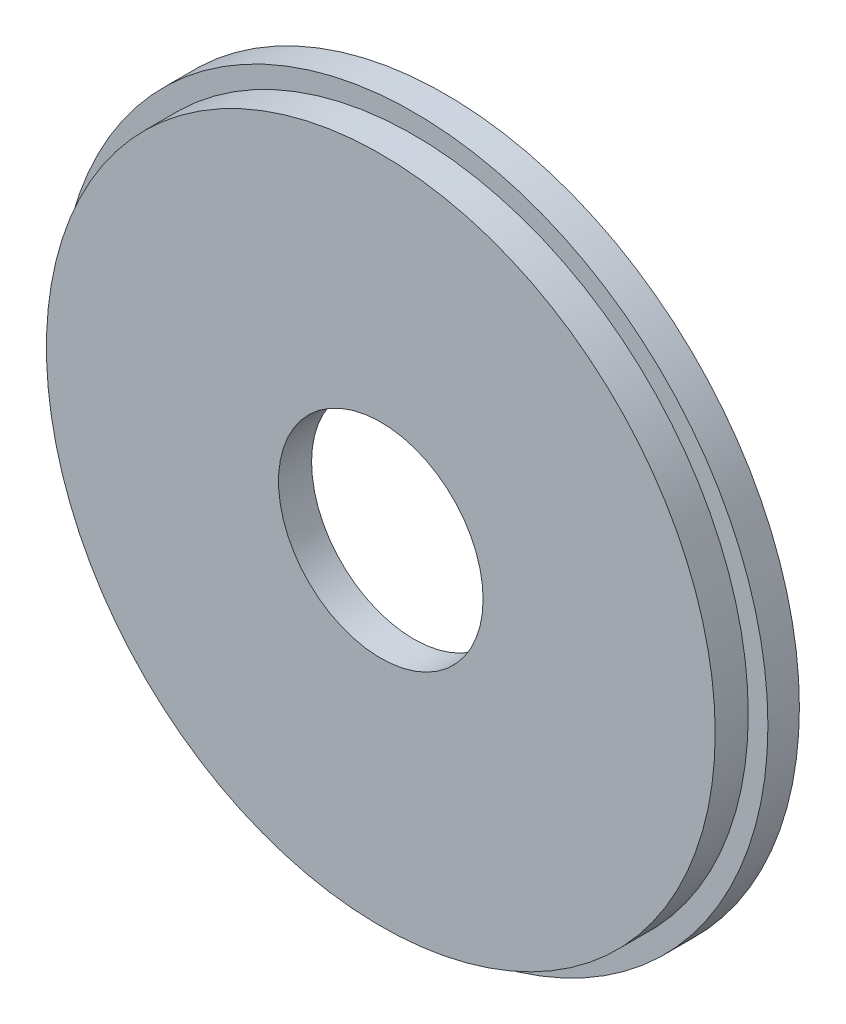
ISO-10303-21;
HEADER;
FILE_DESCRIPTION(('STEP AP214'),'2;1');
FILE_NAME('part.step','',(''),(''),'','','');
FILE_SCHEMA(('AUTOMOTIVE_DESIGN { 1 0 10303 214 1 1 1 1 }'));
ENDSEC;
DATA;
#1=APPLICATION_CONTEXT('core data for automotive mechanical design processes');
#2=APPLICATION_PROTOCOL_DEFINITION('international standard','automotive_design',2000,#1);
#3=PRODUCT_CONTEXT('',#1,'mechanical');
#4=PRODUCT('Part','Part','',(#3));
#5=PRODUCT_RELATED_PRODUCT_CATEGORY('part','',(#4));
#6=PRODUCT_DEFINITION_FORMATION('','',#4);
#7=PRODUCT_DEFINITION_CONTEXT('part definition',#1,'design');
#8=PRODUCT_DEFINITION('design','',#6,#7);
#9=PRODUCT_DEFINITION_SHAPE('','',#8);
#10=(LENGTH_UNIT() NAMED_UNIT(*) SI_UNIT(.MILLI.,.METRE.));
#11=(NAMED_UNIT(*) PLANE_ANGLE_UNIT() SI_UNIT($,.RADIAN.));
#12=(NAMED_UNIT(*) SI_UNIT($,.STERADIAN.) SOLID_ANGLE_UNIT());
#13=UNCERTAINTY_MEASURE_WITH_UNIT(LENGTH_MEASURE(1.E-05),#10,'distance_accuracy_value','');
#14=(GEOMETRIC_REPRESENTATION_CONTEXT(3) GLOBAL_UNCERTAINTY_ASSIGNED_CONTEXT((#13)) GLOBAL_UNIT_ASSIGNED_CONTEXT((#10,
#11,#12)) REPRESENTATION_CONTEXT('',''));
#15=CARTESIAN_POINT('',(0.,0.,0.));
#16=DIRECTION('',(0.,0.,1.));
#17=DIRECTION('',(1.,0.,0.));
#18=AXIS2_PLACEMENT_3D('',#15,#16,#17);
#19=CARTESIAN_POINT('',(0.,0.,0.));
#20=DIRECTION('',(0.,0.,1.));
#21=DIRECTION('',(1.,0.,0.));
#22=AXIS2_PLACEMENT_3D('',#19,#20,#21);
#23=CYLINDRICAL_SURFACE('',#22,13.);
#24=CARTESIAN_POINT('',(0.,0.,8.2));
#25=DIRECTION('',(0.,0.,1.));
#26=DIRECTION('',(1.,0.,0.));
#27=AXIS2_PLACEMENT_3D('',#24,#25,#26);
#28=CIRCLE('',#27,13.);
#29=CARTESIAN_POINT('',(13.,0.,8.2));
#30=VERTEX_POINT('',#29);
#31=EDGE_CURVE('E122',#30,#30,#28,.T.);
#32=ORIENTED_EDGE('',*,*,#31,.T.);
#33=EDGE_LOOP('',(#32));
#34=FACE_BOUND('',#33,.T.);
#35=CARTESIAN_POINT('',(0.,0.,4.));
#36=DIRECTION('',(0.,0.,-1.));
#37=DIRECTION('',(-1.,0.,0.));
#38=AXIS2_PLACEMENT_3D('',#35,#36,#37);
#39=CIRCLE('',#38,13.);
#40=CARTESIAN_POINT('',(-13.,0.,4.));
#41=VERTEX_POINT('',#40);
#42=EDGE_CURVE('E45',#41,#41,#39,.F.);
#43=ORIENTED_EDGE('',*,*,#42,.F.);
#44=EDGE_LOOP('',(#43));
#45=FACE_BOUND('',#44,.T.);
#46=ADVANCED_FACE('F41',(#34,#45),#23,.F.);
#47=CARTESIAN_POINT('',(0.,0.,4.));
#48=DIRECTION('',(0.,0.,-1.));
#49=DIRECTION('',(-1.,0.,0.));
#50=AXIS2_PLACEMENT_3D('',#47,#48,#49);
#51=CYLINDRICAL_SURFACE('',#50,45.);
#52=CARTESIAN_POINT('',(0.,0.,4.));
#53=DIRECTION('',(0.,0.,1.));
#54=DIRECTION('',(1.,0.,0.));
#55=AXIS2_PLACEMENT_3D('',#52,#53,#54);
#56=CIRCLE('',#55,45.);
#57=CARTESIAN_POINT('',(45.,0.,4.));
#58=VERTEX_POINT('',#57);
#59=EDGE_CURVE('E50',#58,#58,#56,.T.);
#60=ORIENTED_EDGE('',*,*,#59,.F.);
#61=EDGE_LOOP('',(#60));
#62=FACE_BOUND('',#61,.T.);
#63=CARTESIAN_POINT('',(0.,0.,0.));
#64=DIRECTION('',(0.,0.,1.));
#65=DIRECTION('',(1.,0.,0.));
#66=AXIS2_PLACEMENT_3D('',#63,#64,#65);
#67=CIRCLE('',#66,45.);
#68=CARTESIAN_POINT('',(45.,0.,0.));
#69=VERTEX_POINT('',#68);
#70=EDGE_CURVE('E127',#69,#69,#67,.T.);
#71=ORIENTED_EDGE('',*,*,#70,.T.);
#72=EDGE_LOOP('',(#71));
#73=FACE_BOUND('',#72,.T.);
#74=ADVANCED_FACE('F43',(#62,#73),#51,.T.);
#75=CARTESIAN_POINT('',(0.,0.,4.));
#76=DIRECTION('',(0.,0.,1.));
#77=DIRECTION('',(1.,0.,0.));
#78=AXIS2_PLACEMENT_3D('',#75,#76,#77);
#79=PLANE('',#78);
#80=CARTESIAN_POINT('',(0.,0.,4.));
#81=DIRECTION('',(0.,0.,1.));
#82=DIRECTION('',(1.,0.,0.));
#83=AXIS2_PLACEMENT_3D('',#80,#81,#82);
#84=CIRCLE('',#83,42.5);
#85=CARTESIAN_POINT('',(42.5,0.,4.));
#86=VERTEX_POINT('',#85);
#87=EDGE_CURVE('E11',#86,#86,#84,.T.);
#88=ORIENTED_EDGE('',*,*,#87,.F.);
#89=EDGE_LOOP('',(#88));
#90=FACE_BOUND('',#89,.T.);
#91=ORIENTED_EDGE('',*,*,#59,.T.);
#92=EDGE_LOOP('',(#91));
#93=FACE_BOUND('',#92,.T.);
#94=ADVANCED_FACE('F137',(#90,#93),#79,.T.);
#95=CARTESIAN_POINT('',(0.,0.,0.));
#96=DIRECTION('',(0.,0.,1.));
#97=DIRECTION('',(1.,0.,0.));
#98=AXIS2_PLACEMENT_3D('',#95,#96,#97);
#99=PLANE('',#98);
#100=DIRECTION('',(1.,0.,0.));
#101=VECTOR('',#100,1.);
#102=CARTESIAN_POINT('',(23.,30.5,0.));
#103=LINE('',#102,#101);
#104=CARTESIAN_POINT('',(-23.,30.5,0.));
#105=VERTEX_POINT('',#104);
#106=CARTESIAN_POINT('',(23.,30.5,0.));
#107=VERTEX_POINT('',#106);
#108=EDGE_CURVE('E93',#105,#107,#103,.T.);
#109=ORIENTED_EDGE('',*,*,#108,.F.);
#110=DIRECTION('',(0.,1.,0.));
#111=VECTOR('',#110,1.);
#112=CARTESIAN_POINT('',(-23.,30.5,0.));
#113=LINE('',#112,#111);
#114=CARTESIAN_POINT('',(-23.,-30.5,0.));
#115=VERTEX_POINT('',#114);
#116=EDGE_CURVE('E58',#115,#105,#113,.T.);
#117=ORIENTED_EDGE('',*,*,#116,.F.);
#118=DIRECTION('',(-1.,0.,0.));
#119=VECTOR('',#118,1.);
#120=CARTESIAN_POINT('',(23.,-30.5,0.));
#121=LINE('',#120,#119);
#122=CARTESIAN_POINT('',(23.,-30.5,0.));
#123=VERTEX_POINT('',#122);
#124=EDGE_CURVE('E110',#123,#115,#121,.T.);
#125=ORIENTED_EDGE('',*,*,#124,.F.);
#126=DIRECTION('',(0.,-1.,0.));
#127=VECTOR('',#126,1.);
#128=CARTESIAN_POINT('',(23.,30.5,0.));
#129=LINE('',#128,#127);
#130=EDGE_CURVE('E116',#107,#123,#129,.T.);
#131=ORIENTED_EDGE('',*,*,#130,.F.);
#132=EDGE_LOOP('',(#109,#117,#125,#131));
#133=FACE_BOUND('',#132,.T.);
#134=ORIENTED_EDGE('',*,*,#70,.F.);
#135=EDGE_LOOP('',(#134));
#136=FACE_BOUND('',#135,.T.);
#137=ADVANCED_FACE('F134',(#133,#136),#99,.F.);
#138=CARTESIAN_POINT('',(0.,0.,8.2));
#139=DIRECTION('',(0.,0.,-1.));
#140=DIRECTION('',(-1.,0.,0.));
#141=AXIS2_PLACEMENT_3D('',#138,#139,#140);
#142=CYLINDRICAL_SURFACE('',#141,42.5);
#143=CARTESIAN_POINT('',(0.,0.,8.2));
#144=DIRECTION('',(0.,0.,1.));
#145=DIRECTION('',(1.,0.,0.));
#146=AXIS2_PLACEMENT_3D('',#143,#144,#145);
#147=CIRCLE('',#146,42.5);
#148=CARTESIAN_POINT('',(42.5,0.,8.2));
#149=VERTEX_POINT('',#148);
#150=EDGE_CURVE('E125',#149,#149,#147,.T.);
#151=ORIENTED_EDGE('',*,*,#150,.F.);
#152=EDGE_LOOP('',(#151));
#153=FACE_BOUND('',#152,.T.);
#154=ORIENTED_EDGE('',*,*,#87,.T.);
#155=EDGE_LOOP('',(#154));
#156=FACE_BOUND('',#155,.T.);
#157=ADVANCED_FACE('F136',(#153,#156),#142,.T.);
#158=CARTESIAN_POINT('',(0.,0.,8.2));
#159=DIRECTION('',(0.,0.,1.));
#160=DIRECTION('',(1.,0.,0.));
#161=AXIS2_PLACEMENT_3D('',#158,#159,#160);
#162=PLANE('',#161);
#163=ORIENTED_EDGE('',*,*,#31,.F.);
#164=EDGE_LOOP('',(#163));
#165=FACE_BOUND('',#164,.T.);
#166=ORIENTED_EDGE('',*,*,#150,.T.);
#167=EDGE_LOOP('',(#166));
#168=FACE_BOUND('',#167,.T.);
#169=ADVANCED_FACE('F144',(#165,#168),#162,.T.);
#170=CARTESIAN_POINT('',(0.,0.,4.));
#171=DIRECTION('',(0.,0.,-1.));
#172=DIRECTION('',(-1.,0.,0.));
#173=AXIS2_PLACEMENT_3D('',#170,#171,#172);
#174=PLANE('',#173);
#175=DIRECTION('',(0.,1.,0.));
#176=VECTOR('',#175,1.);
#177=CARTESIAN_POINT('',(-23.,30.5,4.));
#178=LINE('',#177,#176);
#179=CARTESIAN_POINT('',(-23.,-30.5,4.));
#180=VERTEX_POINT('',#179);
#181=CARTESIAN_POINT('',(-23.,30.5,4.));
#182=VERTEX_POINT('',#181);
#183=EDGE_CURVE('E108',#180,#182,#178,.T.);
#184=ORIENTED_EDGE('',*,*,#183,.T.);
#185=DIRECTION('',(1.,0.,0.));
#186=VECTOR('',#185,1.);
#187=CARTESIAN_POINT('',(23.,30.5,4.));
#188=LINE('',#187,#186);
#189=CARTESIAN_POINT('',(23.,30.5,4.));
#190=VERTEX_POINT('',#189);
#191=EDGE_CURVE('E90',#182,#190,#188,.T.);
#192=ORIENTED_EDGE('',*,*,#191,.T.);
#193=DIRECTION('',(0.,-1.,0.));
#194=VECTOR('',#193,1.);
#195=CARTESIAN_POINT('',(23.,30.5,4.));
#196=LINE('',#195,#194);
#197=CARTESIAN_POINT('',(23.,-30.5,4.));
#198=VERTEX_POINT('',#197);
#199=EDGE_CURVE('E100',#190,#198,#196,.T.);
#200=ORIENTED_EDGE('',*,*,#199,.T.);
#201=DIRECTION('',(-1.,0.,0.));
#202=VECTOR('',#201,1.);
#203=CARTESIAN_POINT('',(23.,-30.5,4.));
#204=LINE('',#203,#202);
#205=EDGE_CURVE('E104',#198,#180,#204,.T.);
#206=ORIENTED_EDGE('',*,*,#205,.T.);
#207=EDGE_LOOP('',(#184,#192,#200,#206));
#208=FACE_BOUND('',#207,.T.);
#209=ORIENTED_EDGE('',*,*,#42,.T.);
#210=EDGE_LOOP('',(#209));
#211=FACE_BOUND('',#210,.T.);
#212=ADVANCED_FACE('F106',(#208,#211),#174,.T.);
#213=CARTESIAN_POINT('',(-23.,30.5,4.));
#214=DIRECTION('',(-1.,0.,0.));
#215=DIRECTION('',(0.,-1.,0.));
#216=AXIS2_PLACEMENT_3D('',#213,#214,#215);
#217=PLANE('',#216);
#218=ORIENTED_EDGE('',*,*,#116,.T.);
#219=DIRECTION('',(0.,0.,-1.));
#220=VECTOR('',#219,1.);
#221=CARTESIAN_POINT('',(-23.,30.5,4.));
#222=LINE('',#221,#220);
#223=EDGE_CURVE('E81',#182,#105,#222,.T.);
#224=ORIENTED_EDGE('',*,*,#223,.F.);
#225=ORIENTED_EDGE('',*,*,#183,.F.);
#226=DIRECTION('',(0.,0.,-1.));
#227=VECTOR('',#226,1.);
#228=CARTESIAN_POINT('',(-23.,-30.5,4.));
#229=LINE('',#228,#227);
#230=EDGE_CURVE('E66',#180,#115,#229,.T.);
#231=ORIENTED_EDGE('',*,*,#230,.T.);
#232=EDGE_LOOP('',(#218,#224,#225,#231));
#233=FACE_BOUND('',#232,.T.);
#234=ADVANCED_FACE('F160',(#233),#217,.F.);
#235=CARTESIAN_POINT('',(23.,-30.5,4.));
#236=DIRECTION('',(0.,-1.,0.));
#237=DIRECTION('',(0.,0.,-1.));
#238=AXIS2_PLACEMENT_3D('',#235,#236,#237);
#239=PLANE('',#238);
#240=ORIENTED_EDGE('',*,*,#124,.T.);
#241=ORIENTED_EDGE('',*,*,#230,.F.);
#242=ORIENTED_EDGE('',*,*,#205,.F.);
#243=DIRECTION('',(0.,0.,-1.));
#244=VECTOR('',#243,1.);
#245=CARTESIAN_POINT('',(23.,-30.5,4.));
#246=LINE('',#245,#244);
#247=EDGE_CURVE('E97',#198,#123,#246,.T.);
#248=ORIENTED_EDGE('',*,*,#247,.T.);
#249=EDGE_LOOP('',(#240,#241,#242,#248));
#250=FACE_BOUND('',#249,.T.);
#251=ADVANCED_FACE('F176',(#250),#239,.F.);
#252=CARTESIAN_POINT('',(23.,30.5,4.));
#253=DIRECTION('',(1.,0.,0.));
#254=DIRECTION('',(0.,1.,0.));
#255=AXIS2_PLACEMENT_3D('',#252,#253,#254);
#256=PLANE('',#255);
#257=ORIENTED_EDGE('',*,*,#130,.T.);
#258=ORIENTED_EDGE('',*,*,#247,.F.);
#259=ORIENTED_EDGE('',*,*,#199,.F.);
#260=DIRECTION('',(0.,0.,-1.));
#261=VECTOR('',#260,1.);
#262=CARTESIAN_POINT('',(23.,30.5,4.));
#263=LINE('',#262,#261);
#264=EDGE_CURVE('E86',#190,#107,#263,.T.);
#265=ORIENTED_EDGE('',*,*,#264,.T.);
#266=EDGE_LOOP('',(#257,#258,#259,#265));
#267=FACE_BOUND('',#266,.T.);
#268=ADVANCED_FACE('F101',(#267),#256,.F.);
#269=CARTESIAN_POINT('',(23.,30.5,4.));
#270=DIRECTION('',(0.,1.,0.));
#271=DIRECTION('',(0.,0.,1.));
#272=AXIS2_PLACEMENT_3D('',#269,#270,#271);
#273=PLANE('',#272);
#274=ORIENTED_EDGE('',*,*,#108,.T.);
#275=ORIENTED_EDGE('',*,*,#264,.F.);
#276=ORIENTED_EDGE('',*,*,#191,.F.);
#277=ORIENTED_EDGE('',*,*,#223,.T.);
#278=EDGE_LOOP('',(#274,#275,#276,#277));
#279=FACE_BOUND('',#278,.T.);
#280=ADVANCED_FACE('F88',(#279),#273,.F.);
#281=CLOSED_SHELL('',(#46,#74,#94,#137,#157,#169,#212,#234,#251,#268,#280));
#282=MANIFOLD_SOLID_BREP('B2',#281);
#283=ADVANCED_BREP_SHAPE_REPRESENTATION('',(#18,#282),#14);
#284=SHAPE_DEFINITION_REPRESENTATION(#9,#283);
ENDSEC;
END-ISO-10303-21;
